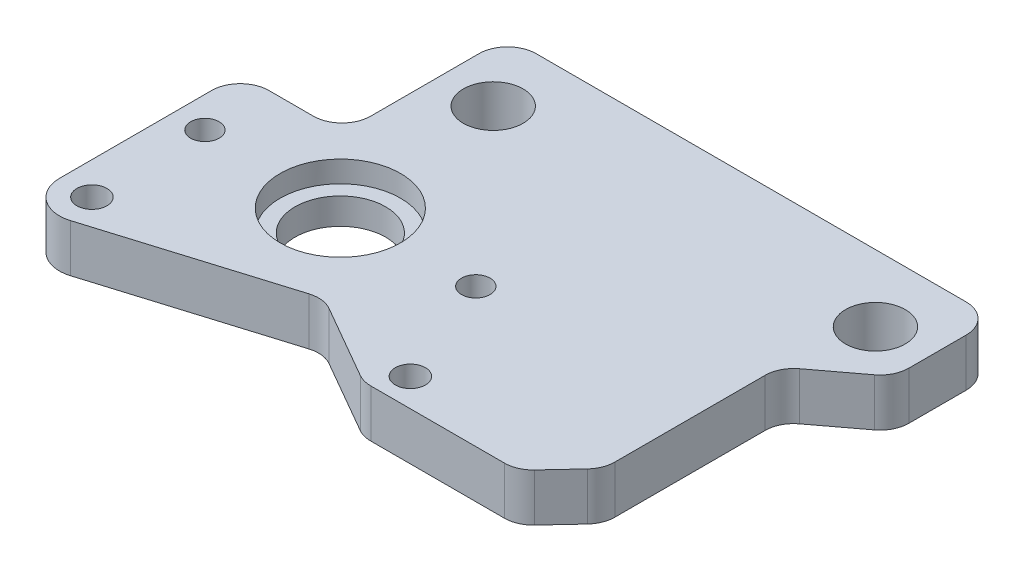
ISO-10303-21;
HEADER;
FILE_DESCRIPTION(('STEP AP214'),'2;1');
FILE_NAME('part.step','',(''),(''),'','','');
FILE_SCHEMA(('AUTOMOTIVE_DESIGN { 1 0 10303 214 1 1 1 1 }'));
ENDSEC;
DATA;
#1=APPLICATION_CONTEXT('core data for automotive mechanical design processes');
#2=APPLICATION_PROTOCOL_DEFINITION('international standard','automotive_design',2000,#1);
#3=PRODUCT_CONTEXT('',#1,'mechanical');
#4=PRODUCT('Part','Part','',(#3));
#5=PRODUCT_RELATED_PRODUCT_CATEGORY('part','',(#4));
#6=PRODUCT_DEFINITION_FORMATION('','',#4);
#7=PRODUCT_DEFINITION_CONTEXT('part definition',#1,'design');
#8=PRODUCT_DEFINITION('design','',#6,#7);
#9=PRODUCT_DEFINITION_SHAPE('','',#8);
#10=(LENGTH_UNIT() NAMED_UNIT(*) SI_UNIT(.MILLI.,.METRE.));
#11=(NAMED_UNIT(*) PLANE_ANGLE_UNIT() SI_UNIT($,.RADIAN.));
#12=(NAMED_UNIT(*) SI_UNIT($,.STERADIAN.) SOLID_ANGLE_UNIT());
#13=UNCERTAINTY_MEASURE_WITH_UNIT(LENGTH_MEASURE(1.E-05),#10,'distance_accuracy_value','');
#14=(GEOMETRIC_REPRESENTATION_CONTEXT(3) GLOBAL_UNCERTAINTY_ASSIGNED_CONTEXT((#13)) GLOBAL_UNIT_ASSIGNED_CONTEXT((#10,
#11,#12)) REPRESENTATION_CONTEXT('',''));
#15=CARTESIAN_POINT('',(0.,0.,0.));
#16=DIRECTION('',(0.,0.,1.));
#17=DIRECTION('',(1.,0.,0.));
#18=AXIS2_PLACEMENT_3D('',#15,#16,#17);
#19=CARTESIAN_POINT('',(0.,-6.35,0.));
#20=DIRECTION('',(0.,1.,0.));
#21=DIRECTION('',(0.,0.,1.));
#22=AXIS2_PLACEMENT_3D('',#19,#20,#21);
#23=CYLINDRICAL_SURFACE('',#22,8.);
#24=CARTESIAN_POINT('',(0.,0.,0.));
#25=DIRECTION('',(0.,1.,0.));
#26=DIRECTION('',(0.,0.,1.));
#27=AXIS2_PLACEMENT_3D('',#24,#25,#26);
#28=CIRCLE('',#27,8.);
#29=CARTESIAN_POINT('',(0.,0.,8.));
#30=VERTEX_POINT('',#29);
#31=EDGE_CURVE('E241',#30,#30,#28,.T.);
#32=ORIENTED_EDGE('',*,*,#31,.T.);
#33=EDGE_LOOP('',(#32));
#34=FACE_BOUND('',#33,.T.);
#35=CARTESIAN_POINT('',(0.,-2.85,0.));
#36=DIRECTION('',(0.,-1.,0.));
#37=DIRECTION('',(0.,0.,-1.));
#38=AXIS2_PLACEMENT_3D('',#35,#36,#37);
#39=CIRCLE('',#38,8.);
#40=CARTESIAN_POINT('',(0.,-2.85,-8.));
#41=VERTEX_POINT('',#40);
#42=EDGE_CURVE('E11',#41,#41,#39,.F.);
#43=ORIENTED_EDGE('',*,*,#42,.F.);
#44=EDGE_LOOP('',(#43));
#45=FACE_BOUND('',#44,.T.);
#46=ADVANCED_FACE('F43',(#34,#45),#23,.F.);
#47=CARTESIAN_POINT('',(4.00320661854568,-6.35,13.0969768672636));
#48=DIRECTION('',(-0.29230886403007,0.,-0.95632396603319));
#49=DIRECTION('',(-0.95632396603319,0.,0.29230886403007));
#50=AXIS2_PLACEMENT_3D('',#47,#48,#49);
#51=PLANE('',#50);
#52=DIRECTION('',(-0.95632396603319,0.,0.29230886403007));
#53=VECTOR('',#52,1.);
#54=CARTESIAN_POINT('',(4.00320661854568,0.,13.0969768672636));
#55=LINE('',#54,#53);
#56=CARTESIAN_POINT('',(7.76555921931062,0.,11.9469805753459));
#57=VERTEX_POINT('',#56);
#58=CARTESIAN_POINT('',(-16.5178103251182,0.,19.3694068853313));
#59=VERTEX_POINT('',#58);
#60=EDGE_CURVE('E261',#57,#59,#55,.T.);
#61=ORIENTED_EDGE('',*,*,#60,.T.);
#62=DIRECTION('',(0.,1.,0.));
#63=VECTOR('',#62,1.);
#64=CARTESIAN_POINT('',(-16.5178103251182,-6.35,19.3694068853313));
#65=LINE('',#64,#63);
#66=CARTESIAN_POINT('',(-16.5178103251182,-6.35,19.3694068853313));
#67=VERTEX_POINT('',#66);
#68=EDGE_CURVE('E53',#67,#59,#65,.T.);
#69=ORIENTED_EDGE('',*,*,#68,.F.);
#70=DIRECTION('',(-0.95632396603319,0.,0.29230886403007));
#71=VECTOR('',#70,1.);
#72=CARTESIAN_POINT('',(4.00320661854568,-6.35,13.0969768672636));
#73=LINE('',#72,#71);
#74=CARTESIAN_POINT('',(7.76555921931062,-6.35,11.9469805753459));
#75=VERTEX_POINT('',#74);
#76=EDGE_CURVE('E405',#75,#67,#73,.T.);
#77=ORIENTED_EDGE('',*,*,#76,.F.);
#78=DIRECTION('',(0.,1.,0.));
#79=VECTOR('',#78,1.);
#80=CARTESIAN_POINT('',(7.76555921931062,-6.35,11.9469805753459));
#81=LINE('',#80,#79);
#82=EDGE_CURVE('E141',#75,#57,#81,.T.);
#83=ORIENTED_EDGE('',*,*,#82,.T.);
#84=EDGE_LOOP('',(#61,#69,#77,#83));
#85=FACE_BOUND('',#84,.T.);
#86=ADVANCED_FACE('F403',(#85),#51,.F.);
#87=CARTESIAN_POINT('',(-17.78,-6.35,15.24));
#88=DIRECTION('',(0.,1.,0.));
#89=DIRECTION('',(0.,0.,1.));
#90=AXIS2_PLACEMENT_3D('',#87,#88,#89);
#91=CYLINDRICAL_SURFACE('',#90,4.318);
#92=CARTESIAN_POINT('',(-17.78,0.,15.24));
#93=DIRECTION('',(0.,1.,0.));
#94=DIRECTION('',(0.,0.,1.));
#95=AXIS2_PLACEMENT_3D('',#92,#93,#94);
#96=CIRCLE('',#95,4.318);
#97=CARTESIAN_POINT('',(-22.098,0.,15.24));
#98=VERTEX_POINT('',#97);
#99=EDGE_CURVE('E129',#59,#98,#96,.F.);
#100=ORIENTED_EDGE('',*,*,#99,.T.);
#101=DIRECTION('',(0.,1.,0.));
#102=VECTOR('',#101,1.);
#103=CARTESIAN_POINT('',(-22.098,-6.35,15.24));
#104=LINE('',#103,#102);
#105=CARTESIAN_POINT('',(-22.098,-6.35,15.24));
#106=VERTEX_POINT('',#105);
#107=EDGE_CURVE('E216',#106,#98,#104,.T.);
#108=ORIENTED_EDGE('',*,*,#107,.F.);
#109=CARTESIAN_POINT('',(-17.78,-6.35,15.24));
#110=DIRECTION('',(0.,1.,0.));
#111=DIRECTION('',(0.,0.,1.));
#112=AXIS2_PLACEMENT_3D('',#109,#110,#111);
#113=CIRCLE('',#112,4.318);
#114=EDGE_CURVE('E61',#67,#106,#113,.F.);
#115=ORIENTED_EDGE('',*,*,#114,.F.);
#116=ORIENTED_EDGE('',*,*,#68,.T.);
#117=EDGE_LOOP('',(#100,#108,#115,#116));
#118=FACE_BOUND('',#117,.T.);
#119=ADVANCED_FACE('F601',(#118),#91,.T.);
#120=CARTESIAN_POINT('',(-22.098,-6.35,0.));
#121=DIRECTION('',(1.,0.,0.));
#122=DIRECTION('',(0.,0.,-1.));
#123=AXIS2_PLACEMENT_3D('',#120,#121,#122);
#124=PLANE('',#123);
#125=DIRECTION('',(0.,0.,-1.));
#126=VECTOR('',#125,1.);
#127=CARTESIAN_POINT('',(-22.098,0.,0.));
#128=LINE('',#127,#126);
#129=CARTESIAN_POINT('',(-22.098,0.,-4.98750012199999));
#130=VERTEX_POINT('',#129);
#131=EDGE_CURVE('E212',#98,#130,#128,.T.);
#132=ORIENTED_EDGE('',*,*,#131,.T.);
#133=DIRECTION('',(0.,1.,0.));
#134=VECTOR('',#133,1.);
#135=CARTESIAN_POINT('',(-22.098,-6.35,-4.98750012199999));
#136=LINE('',#135,#134);
#137=CARTESIAN_POINT('',(-22.098,-6.35,-4.98750012199999));
#138=VERTEX_POINT('',#137);
#139=EDGE_CURVE('E210',#138,#130,#136,.T.);
#140=ORIENTED_EDGE('',*,*,#139,.F.);
#141=DIRECTION('',(0.,0.,-1.));
#142=VECTOR('',#141,1.);
#143=CARTESIAN_POINT('',(-22.098,-6.35,0.));
#144=LINE('',#143,#142);
#145=EDGE_CURVE('E199',#106,#138,#144,.T.);
#146=ORIENTED_EDGE('',*,*,#145,.F.);
#147=ORIENTED_EDGE('',*,*,#107,.T.);
#148=EDGE_LOOP('',(#132,#140,#146,#147));
#149=FACE_BOUND('',#148,.T.);
#150=ADVANCED_FACE('F211',(#149),#124,.F.);
#151=CARTESIAN_POINT('',(-18.288,-6.35,-4.98750012199999));
#152=DIRECTION('',(0.,1.,0.));
#153=DIRECTION('',(0.,0.,1.));
#154=AXIS2_PLACEMENT_3D('',#151,#152,#153);
#155=CYLINDRICAL_SURFACE('',#154,3.81);
#156=CARTESIAN_POINT('',(-18.288,0.,-4.98750012199999));
#157=DIRECTION('',(0.,1.,0.));
#158=DIRECTION('',(0.,0.,1.));
#159=AXIS2_PLACEMENT_3D('',#156,#157,#158);
#160=CIRCLE('',#159,3.81);
#161=CARTESIAN_POINT('',(-18.288,0.,-8.797500122));
#162=VERTEX_POINT('',#161);
#163=EDGE_CURVE('E330',#130,#162,#160,.F.);
#164=ORIENTED_EDGE('',*,*,#163,.T.);
#165=DIRECTION('',(0.,1.,0.));
#166=VECTOR('',#165,1.);
#167=CARTESIAN_POINT('',(-18.288,-6.35,-8.797500122));
#168=LINE('',#167,#166);
#169=CARTESIAN_POINT('',(-18.288,-6.35,-8.797500122));
#170=VERTEX_POINT('',#169);
#171=EDGE_CURVE('E217',#170,#162,#168,.T.);
#172=ORIENTED_EDGE('',*,*,#171,.F.);
#173=CARTESIAN_POINT('',(-18.288,-6.35,-4.98750012199999));
#174=DIRECTION('',(0.,1.,0.));
#175=DIRECTION('',(0.,0.,1.));
#176=AXIS2_PLACEMENT_3D('',#173,#174,#175);
#177=CIRCLE('',#176,3.81);
#178=EDGE_CURVE('E204',#138,#170,#177,.F.);
#179=ORIENTED_EDGE('',*,*,#178,.F.);
#180=ORIENTED_EDGE('',*,*,#139,.T.);
#181=EDGE_LOOP('',(#164,#172,#179,#180));
#182=FACE_BOUND('',#181,.T.);
#183=ADVANCED_FACE('F219',(#182),#155,.T.);
#184=CARTESIAN_POINT('',(0.,-6.35,-8.797500122));
#185=DIRECTION('',(0.,0.,1.));
#186=DIRECTION('',(1.,0.,0.));
#187=AXIS2_PLACEMENT_3D('',#184,#185,#186);
#188=PLANE('',#187);
#189=DIRECTION('',(1.,0.,0.));
#190=VECTOR('',#189,1.);
#191=CARTESIAN_POINT('',(0.,0.,-8.797500122));
#192=LINE('',#191,#190);
#193=CARTESIAN_POINT('',(-12.3825,0.,-8.797500122));
#194=VERTEX_POINT('',#193);
#195=EDGE_CURVE('E327',#162,#194,#192,.T.);
#196=ORIENTED_EDGE('',*,*,#195,.T.);
#197=DIRECTION('',(0.,1.,0.));
#198=VECTOR('',#197,1.);
#199=CARTESIAN_POINT('',(-12.3825,-6.35,-8.797500122));
#200=LINE('',#199,#198);
#201=CARTESIAN_POINT('',(-12.3825,-6.35,-8.797500122));
#202=VERTEX_POINT('',#201);
#203=EDGE_CURVE('E344',#202,#194,#200,.T.);
#204=ORIENTED_EDGE('',*,*,#203,.F.);
#205=DIRECTION('',(1.,0.,0.));
#206=VECTOR('',#205,1.);
#207=CARTESIAN_POINT('',(0.,-6.35,-8.797500122));
#208=LINE('',#207,#206);
#209=EDGE_CURVE('E223',#170,#202,#208,.T.);
#210=ORIENTED_EDGE('',*,*,#209,.F.);
#211=ORIENTED_EDGE('',*,*,#171,.T.);
#212=EDGE_LOOP('',(#196,#204,#210,#211));
#213=FACE_BOUND('',#212,.T.);
#214=ADVANCED_FACE('F502',(#213),#188,.F.);
#215=CARTESIAN_POINT('',(-12.3825,-6.35,-12.607500122));
#216=DIRECTION('',(0.,1.,0.));
#217=DIRECTION('',(0.,0.,1.));
#218=AXIS2_PLACEMENT_3D('',#215,#216,#217);
#219=CYLINDRICAL_SURFACE('',#218,3.81);
#220=CARTESIAN_POINT('',(-12.3825,0.,-12.607500122));
#221=DIRECTION('',(0.,1.,0.));
#222=DIRECTION('',(0.,0.,1.));
#223=AXIS2_PLACEMENT_3D('',#220,#221,#222);
#224=CIRCLE('',#223,3.81);
#225=CARTESIAN_POINT('',(-8.57250000000001,0.,-12.607500122));
#226=VERTEX_POINT('',#225);
#227=EDGE_CURVE('E323',#194,#226,#224,.T.);
#228=ORIENTED_EDGE('',*,*,#227,.T.);
#229=DIRECTION('',(0.,1.,0.));
#230=VECTOR('',#229,1.);
#231=CARTESIAN_POINT('',(-8.57250000000001,-6.35,-12.607500122));
#232=LINE('',#231,#230);
#233=CARTESIAN_POINT('',(-8.57250000000001,-6.35,-12.607500122));
#234=VERTEX_POINT('',#233);
#235=EDGE_CURVE('E348',#234,#226,#232,.T.);
#236=ORIENTED_EDGE('',*,*,#235,.F.);
#237=CARTESIAN_POINT('',(-12.3825,-6.35,-12.607500122));
#238=DIRECTION('',(0.,1.,0.));
#239=DIRECTION('',(0.,0.,1.));
#240=AXIS2_PLACEMENT_3D('',#237,#238,#239);
#241=CIRCLE('',#240,3.81);
#242=EDGE_CURVE('E226',#202,#234,#241,.T.);
#243=ORIENTED_EDGE('',*,*,#242,.F.);
#244=ORIENTED_EDGE('',*,*,#203,.T.);
#245=EDGE_LOOP('',(#228,#236,#243,#244));
#246=FACE_BOUND('',#245,.T.);
#247=ADVANCED_FACE('F498',(#246),#219,.F.);
#248=CARTESIAN_POINT('',(-8.57250000000001,-6.35,0.));
#249=DIRECTION('',(-1.,0.,0.));
#250=DIRECTION('',(0.,0.,1.));
#251=AXIS2_PLACEMENT_3D('',#248,#249,#250);
#252=PLANE('',#251);
#253=DIRECTION('',(0.,0.,1.));
#254=VECTOR('',#253,1.);
#255=CARTESIAN_POINT('',(-8.57250000000001,0.,0.));
#256=LINE('',#255,#254);
#257=CARTESIAN_POINT('',(-8.5725,0.,-26.9875));
#258=VERTEX_POINT('',#257);
#259=EDGE_CURVE('E319',#258,#226,#256,.T.);
#260=ORIENTED_EDGE('',*,*,#259,.F.);
#261=DIRECTION('',(0.,1.,0.));
#262=VECTOR('',#261,1.);
#263=CARTESIAN_POINT('',(-8.5725,-6.35,-26.9875));
#264=LINE('',#263,#262);
#265=CARTESIAN_POINT('',(-8.5725,-6.35,-26.9875));
#266=VERTEX_POINT('',#265);
#267=EDGE_CURVE('E351',#266,#258,#264,.T.);
#268=ORIENTED_EDGE('',*,*,#267,.F.);
#269=DIRECTION('',(0.,0.,1.));
#270=VECTOR('',#269,1.);
#271=CARTESIAN_POINT('',(-8.57250000000001,-6.35,0.));
#272=LINE('',#271,#270);
#273=EDGE_CURVE('E495',#266,#234,#272,.T.);
#274=ORIENTED_EDGE('',*,*,#273,.T.);
#275=ORIENTED_EDGE('',*,*,#235,.T.);
#276=EDGE_LOOP('',(#260,#268,#274,#275));
#277=FACE_BOUND('',#276,.T.);
#278=ADVANCED_FACE('F491',(#277),#252,.T.);
#279=CARTESIAN_POINT('',(-4.7625,-6.35,-26.9875));
#280=DIRECTION('',(0.,1.,0.));
#281=DIRECTION('',(0.,0.,1.));
#282=AXIS2_PLACEMENT_3D('',#279,#280,#281);
#283=CYLINDRICAL_SURFACE('',#282,3.81);
#284=CARTESIAN_POINT('',(-4.7625,0.,-26.9875));
#285=DIRECTION('',(0.,1.,0.));
#286=DIRECTION('',(0.,0.,1.));
#287=AXIS2_PLACEMENT_3D('',#284,#285,#286);
#288=CIRCLE('',#287,3.81);
#289=CARTESIAN_POINT('',(-4.7625,0.,-30.7975));
#290=VERTEX_POINT('',#289);
#291=EDGE_CURVE('E315',#258,#290,#288,.F.);
#292=ORIENTED_EDGE('',*,*,#291,.T.);
#293=DIRECTION('',(0.,1.,0.));
#294=VECTOR('',#293,1.);
#295=CARTESIAN_POINT('',(-4.7625,-6.35,-30.7975));
#296=LINE('',#295,#294);
#297=CARTESIAN_POINT('',(-4.7625,-6.35,-30.7975));
#298=VERTEX_POINT('',#297);
#299=EDGE_CURVE('E354',#298,#290,#296,.T.);
#300=ORIENTED_EDGE('',*,*,#299,.F.);
#301=CARTESIAN_POINT('',(-4.7625,-6.35,-26.9875));
#302=DIRECTION('',(0.,1.,0.));
#303=DIRECTION('',(0.,0.,1.));
#304=AXIS2_PLACEMENT_3D('',#301,#302,#303);
#305=CIRCLE('',#304,3.81);
#306=EDGE_CURVE('E505',#266,#298,#305,.F.);
#307=ORIENTED_EDGE('',*,*,#306,.F.);
#308=ORIENTED_EDGE('',*,*,#267,.T.);
#309=EDGE_LOOP('',(#292,#300,#307,#308));
#310=FACE_BOUND('',#309,.T.);
#311=ADVANCED_FACE('F487',(#310),#283,.T.);
#312=CARTESIAN_POINT('',(0.,-6.35,-30.7975));
#313=DIRECTION('',(0.,0.,-1.));
#314=DIRECTION('',(-1.,0.,0.));
#315=AXIS2_PLACEMENT_3D('',#312,#313,#314);
#316=PLANE('',#315);
#317=DIRECTION('',(-1.,0.,0.));
#318=VECTOR('',#317,1.);
#319=CARTESIAN_POINT('',(0.,0.,-30.7975));
#320=LINE('',#319,#318);
#321=CARTESIAN_POINT('',(52.3875,0.,-30.7975));
#322=VERTEX_POINT('',#321);
#323=EDGE_CURVE('E311',#322,#290,#320,.T.);
#324=ORIENTED_EDGE('',*,*,#323,.F.);
#325=DIRECTION('',(0.,1.,0.));
#326=VECTOR('',#325,1.);
#327=CARTESIAN_POINT('',(52.3875,-6.35,-30.7975));
#328=LINE('',#327,#326);
#329=CARTESIAN_POINT('',(52.3875,-6.35,-30.7975));
#330=VERTEX_POINT('',#329);
#331=EDGE_CURVE('E357',#330,#322,#328,.T.);
#332=ORIENTED_EDGE('',*,*,#331,.F.);
#333=DIRECTION('',(-1.,0.,0.));
#334=VECTOR('',#333,1.);
#335=CARTESIAN_POINT('',(0.,-6.35,-30.7975));
#336=LINE('',#335,#334);
#337=EDGE_CURVE('E484',#330,#298,#336,.T.);
#338=ORIENTED_EDGE('',*,*,#337,.T.);
#339=ORIENTED_EDGE('',*,*,#299,.T.);
#340=EDGE_LOOP('',(#324,#332,#338,#339));
#341=FACE_BOUND('',#340,.T.);
#342=ADVANCED_FACE('F480',(#341),#316,.T.);
#343=CARTESIAN_POINT('',(52.3875,-6.35,-26.9875));
#344=DIRECTION('',(0.,1.,0.));
#345=DIRECTION('',(0.,0.,1.));
#346=AXIS2_PLACEMENT_3D('',#343,#344,#345);
#347=CYLINDRICAL_SURFACE('',#346,3.81);
#348=CARTESIAN_POINT('',(52.3875,0.,-26.9875));
#349=DIRECTION('',(0.,1.,0.));
#350=DIRECTION('',(0.,0.,1.));
#351=AXIS2_PLACEMENT_3D('',#348,#349,#350);
#352=CIRCLE('',#351,3.81);
#353=CARTESIAN_POINT('',(56.1975,0.,-26.9875));
#354=VERTEX_POINT('',#353);
#355=EDGE_CURVE('E307',#322,#354,#352,.F.);
#356=ORIENTED_EDGE('',*,*,#355,.T.);
#357=DIRECTION('',(0.,1.,0.));
#358=VECTOR('',#357,1.);
#359=CARTESIAN_POINT('',(56.1975,-6.35,-26.9875));
#360=LINE('',#359,#358);
#361=CARTESIAN_POINT('',(56.1975,-6.35,-26.9875));
#362=VERTEX_POINT('',#361);
#363=EDGE_CURVE('E360',#362,#354,#360,.T.);
#364=ORIENTED_EDGE('',*,*,#363,.F.);
#365=CARTESIAN_POINT('',(52.3875,-6.35,-26.9875));
#366=DIRECTION('',(0.,1.,0.));
#367=DIRECTION('',(0.,0.,1.));
#368=AXIS2_PLACEMENT_3D('',#365,#366,#367);
#369=CIRCLE('',#368,3.81);
#370=EDGE_CURVE('E512',#330,#362,#369,.F.);
#371=ORIENTED_EDGE('',*,*,#370,.F.);
#372=ORIENTED_EDGE('',*,*,#331,.T.);
#373=EDGE_LOOP('',(#356,#364,#371,#372));
#374=FACE_BOUND('',#373,.T.);
#375=ADVANCED_FACE('F476',(#374),#347,.T.);
#376=CARTESIAN_POINT('',(56.1975,-6.35,1.02276151248003E-13));
#377=DIRECTION('',(1.,0.,0.));
#378=DIRECTION('',(0.,0.,-1.));
#379=AXIS2_PLACEMENT_3D('',#376,#377,#378);
#380=PLANE('',#379);
#381=DIRECTION('',(0.,0.,-1.));
#382=VECTOR('',#381,1.);
#383=CARTESIAN_POINT('',(56.1975,0.,1.02276151248003E-13));
#384=LINE('',#383,#382);
#385=CARTESIAN_POINT('',(56.1975,0.,-19.3620959266836));
#386=VERTEX_POINT('',#385);
#387=EDGE_CURVE('E303',#386,#354,#384,.T.);
#388=ORIENTED_EDGE('',*,*,#387,.F.);
#389=DIRECTION('',(0.,1.,0.));
#390=VECTOR('',#389,1.);
#391=CARTESIAN_POINT('',(56.1975,-6.35,-19.3620959266836));
#392=LINE('',#391,#390);
#393=CARTESIAN_POINT('',(56.1975,-6.35,-19.3620959266836));
#394=VERTEX_POINT('',#393);
#395=EDGE_CURVE('E363',#394,#386,#392,.T.);
#396=ORIENTED_EDGE('',*,*,#395,.F.);
#397=DIRECTION('',(0.,0.,-1.));
#398=VECTOR('',#397,1.);
#399=CARTESIAN_POINT('',(56.1975,-6.35,1.02276151248003E-13));
#400=LINE('',#399,#398);
#401=EDGE_CURVE('E473',#394,#362,#400,.T.);
#402=ORIENTED_EDGE('',*,*,#401,.T.);
#403=ORIENTED_EDGE('',*,*,#363,.T.);
#404=EDGE_LOOP('',(#388,#396,#402,#403));
#405=FACE_BOUND('',#404,.T.);
#406=ADVANCED_FACE('F468',(#405),#380,.T.);
#407=CARTESIAN_POINT('',(52.3875,-6.35,-19.3620959266836));
#408=DIRECTION('',(0.,1.,0.));
#409=DIRECTION('',(0.,0.,1.));
#410=AXIS2_PLACEMENT_3D('',#407,#408,#409);
#411=CYLINDRICAL_SURFACE('',#410,3.81);
#412=CARTESIAN_POINT('',(52.3875,0.,-19.3620959266836));
#413=DIRECTION('',(0.,1.,0.));
#414=DIRECTION('',(0.,0.,1.));
#415=AXIS2_PLACEMENT_3D('',#412,#413,#414);
#416=CIRCLE('',#415,3.81);
#417=CARTESIAN_POINT('',(54.6804152382093,0.,-16.3192946334034));
#418=VERTEX_POINT('',#417);
#419=EDGE_CURVE('E299',#386,#418,#416,.F.);
#420=ORIENTED_EDGE('',*,*,#419,.T.);
#421=DIRECTION('',(0.,1.,0.));
#422=VECTOR('',#421,1.);
#423=CARTESIAN_POINT('',(54.6804152382093,-6.35,-16.3192946334034));
#424=LINE('',#423,#422);
#425=CARTESIAN_POINT('',(54.6804152382093,-6.35,-16.3192946334034));
#426=VERTEX_POINT('',#425);
#427=EDGE_CURVE('E366',#426,#418,#424,.T.);
#428=ORIENTED_EDGE('',*,*,#427,.F.);
#429=CARTESIAN_POINT('',(52.3875,-6.35,-19.3620959266836));
#430=DIRECTION('',(0.,1.,0.));
#431=DIRECTION('',(0.,0.,1.));
#432=AXIS2_PLACEMENT_3D('',#429,#430,#431);
#433=CIRCLE('',#432,3.81);
#434=EDGE_CURVE('E517',#394,#426,#433,.F.);
#435=ORIENTED_EDGE('',*,*,#434,.F.);
#436=ORIENTED_EDGE('',*,*,#395,.T.);
#437=EDGE_LOOP('',(#420,#428,#435,#436));
#438=FACE_BOUND('',#437,.T.);
#439=ADVANCED_FACE('F782',(#438),#411,.T.);
#440=CARTESIAN_POINT('',(11.9606686655756,-6.35,15.8723434157696));
#441=DIRECTION('',(0.601815023152047,0.,0.798635510047294));
#442=DIRECTION('',(0.798635510047294,0.,-0.601815023152047));
#443=AXIS2_PLACEMENT_3D('',#440,#441,#442);
#444=PLANE('',#443);
#445=DIRECTION('',(0.798635510047294,0.,-0.601815023152047));
#446=VECTOR('',#445,1.);
#447=CARTESIAN_POINT('',(11.9606686655756,0.,15.8723434157696));
#448=LINE('',#447,#446);
#449=CARTESIAN_POINT('',(48.9855664772033,0.,-12.0279182848244));
#450=VERTEX_POINT('',#449);
#451=EDGE_CURVE('E295',#450,#418,#448,.T.);
#452=ORIENTED_EDGE('',*,*,#451,.F.);
#453=DIRECTION('',(0.,1.,0.));
#454=VECTOR('',#453,1.);
#455=CARTESIAN_POINT('',(48.9855664772033,-6.35,-12.0279182848244));
#456=LINE('',#455,#454);
#457=CARTESIAN_POINT('',(48.9855664772033,-6.35,-12.0279182848244));
#458=VERTEX_POINT('',#457);
#459=EDGE_CURVE('E369',#458,#450,#456,.T.);
#460=ORIENTED_EDGE('',*,*,#459,.F.);
#461=DIRECTION('',(0.798635510047294,0.,-0.601815023152047));
#462=VECTOR('',#461,1.);
#463=CARTESIAN_POINT('',(11.9606686655756,-6.35,15.8723434157696));
#464=LINE('',#463,#462);
#465=EDGE_CURVE('E520',#458,#426,#464,.T.);
#466=ORIENTED_EDGE('',*,*,#465,.T.);
#467=ORIENTED_EDGE('',*,*,#427,.T.);
#468=EDGE_LOOP('',(#452,#460,#466,#467));
#469=FACE_BOUND('',#468,.T.);
#470=ADVANCED_FACE('F461',(#469),#444,.T.);
#471=CARTESIAN_POINT('',(51.2784817154126,-6.35,-8.98511699154425));
#472=DIRECTION('',(0.,1.,0.));
#473=DIRECTION('',(0.,0.,1.));
#474=AXIS2_PLACEMENT_3D('',#471,#472,#473);
#475=CYLINDRICAL_SURFACE('',#474,3.80999999999999);
#476=CARTESIAN_POINT('',(51.2784817154126,0.,-8.98511699154425));
#477=DIRECTION('',(0.,1.,0.));
#478=DIRECTION('',(0.,0.,1.));
#479=AXIS2_PLACEMENT_3D('',#476,#477,#478);
#480=CIRCLE('',#479,3.80999999999999);
#481=CARTESIAN_POINT('',(47.4684817154126,0.,-8.98511699154425));
#482=VERTEX_POINT('',#481);
#483=EDGE_CURVE('E291',#482,#450,#480,.F.);
#484=ORIENTED_EDGE('',*,*,#483,.F.);
#485=DIRECTION('',(0.,1.,0.));
#486=VECTOR('',#485,1.);
#487=CARTESIAN_POINT('',(47.4684817154126,-6.35,-8.98511699154425));
#488=LINE('',#487,#486);
#489=CARTESIAN_POINT('',(47.4684817154126,-6.35,-8.98511699154425));
#490=VERTEX_POINT('',#489);
#491=EDGE_CURVE('E372',#490,#482,#488,.T.);
#492=ORIENTED_EDGE('',*,*,#491,.F.);
#493=CARTESIAN_POINT('',(51.2784817154126,-6.35,-8.98511699154425));
#494=DIRECTION('',(0.,1.,0.));
#495=DIRECTION('',(0.,0.,1.));
#496=AXIS2_PLACEMENT_3D('',#493,#494,#495);
#497=CIRCLE('',#496,3.80999999999999);
#498=EDGE_CURVE('E457',#490,#458,#497,.F.);
#499=ORIENTED_EDGE('',*,*,#498,.T.);
#500=ORIENTED_EDGE('',*,*,#459,.T.);
#501=EDGE_LOOP('',(#484,#492,#499,#500));
#502=FACE_BOUND('',#501,.T.);
#503=ADVANCED_FACE('F454',(#502),#475,.F.);
#504=CARTESIAN_POINT('',(47.4684817154126,-6.35,0.));
#505=DIRECTION('',(-1.,0.,0.));
#506=DIRECTION('',(0.,0.,1.));
#507=AXIS2_PLACEMENT_3D('',#504,#505,#506);
#508=PLANE('',#507);
#509=DIRECTION('',(0.,0.,1.));
#510=VECTOR('',#509,1.);
#511=CARTESIAN_POINT('',(47.4684817154126,0.,0.));
#512=LINE('',#511,#510);
#513=CARTESIAN_POINT('',(47.4684817154126,0.,10.9806107725939));
#514=VERTEX_POINT('',#513);
#515=EDGE_CURVE('E288',#482,#514,#512,.T.);
#516=ORIENTED_EDGE('',*,*,#515,.T.);
#517=DIRECTION('',(0.,1.,0.));
#518=VECTOR('',#517,1.);
#519=CARTESIAN_POINT('',(47.4684817154126,-6.35,10.9806107725939));
#520=LINE('',#519,#518);
#521=CARTESIAN_POINT('',(47.4684817154126,-6.35,10.9806107725939));
#522=VERTEX_POINT('',#521);
#523=EDGE_CURVE('E375',#522,#514,#520,.T.);
#524=ORIENTED_EDGE('',*,*,#523,.F.);
#525=DIRECTION('',(0.,0.,1.));
#526=VECTOR('',#525,1.);
#527=CARTESIAN_POINT('',(47.4684817154126,-6.35,0.));
#528=LINE('',#527,#526);
#529=EDGE_CURVE('E450',#490,#522,#528,.T.);
#530=ORIENTED_EDGE('',*,*,#529,.F.);
#531=ORIENTED_EDGE('',*,*,#491,.T.);
#532=EDGE_LOOP('',(#516,#524,#530,#531));
#533=FACE_BOUND('',#532,.T.);
#534=ADVANCED_FACE('F449',(#533),#508,.F.);
#535=CARTESIAN_POINT('',(43.6584817154126,-6.35,10.9806107725939));
#536=DIRECTION('',(0.,1.,0.));
#537=DIRECTION('',(0.,0.,1.));
#538=AXIS2_PLACEMENT_3D('',#535,#536,#537);
#539=CYLINDRICAL_SURFACE('',#538,3.81);
#540=CARTESIAN_POINT('',(43.6584817154126,0.,10.9806107725939));
#541=DIRECTION('',(0.,1.,0.));
#542=DIRECTION('',(0.,0.,1.));
#543=AXIS2_PLACEMENT_3D('',#540,#541,#542);
#544=CIRCLE('',#543,3.81);
#545=CARTESIAN_POINT('',(46.4449393185816,0.,13.579024524432));
#546=VERTEX_POINT('',#545);
#547=EDGE_CURVE('E285',#514,#546,#544,.F.);
#548=ORIENTED_EDGE('',*,*,#547,.T.);
#549=DIRECTION('',(0.,1.,0.));
#550=VECTOR('',#549,1.);
#551=CARTESIAN_POINT('',(46.4449393185816,-6.35,13.579024524432));
#552=LINE('',#551,#550);
#553=CARTESIAN_POINT('',(46.4449393185816,-6.35,13.579024524432));
#554=VERTEX_POINT('',#553);
#555=EDGE_CURVE('E379',#554,#546,#552,.T.);
#556=ORIENTED_EDGE('',*,*,#555,.F.);
#557=CARTESIAN_POINT('',(43.6584817154126,-6.35,10.9806107725939));
#558=DIRECTION('',(0.,1.,0.));
#559=DIRECTION('',(0.,0.,1.));
#560=AXIS2_PLACEMENT_3D('',#557,#558,#559);
#561=CIRCLE('',#560,3.81);
#562=EDGE_CURVE('E445',#522,#554,#561,.F.);
#563=ORIENTED_EDGE('',*,*,#562,.F.);
#564=ORIENTED_EDGE('',*,*,#523,.T.);
#565=EDGE_LOOP('',(#548,#556,#563,#564));
#566=FACE_BOUND('',#565,.T.);
#567=ADVANCED_FACE('F444',(#566),#539,.T.);
#568=CARTESIAN_POINT('',(31.6153606059378,-6.35,29.4818007187193));
#569=DIRECTION('',(-0.73135370161917,0.,-0.681998360062499));
#570=DIRECTION('',(-0.681998360062499,0.,0.73135370161917));
#571=AXIS2_PLACEMENT_3D('',#568,#569,#570);
#572=PLANE('',#571);
#573=DIRECTION('',(-0.681998360062499,0.,0.73135370161917));
#574=VECTOR('',#573,1.);
#575=CARTESIAN_POINT('',(31.6153606059378,0.,29.4818007187193));
#576=LINE('',#575,#574);
#577=CARTESIAN_POINT('',(43.0441600965525,0.,17.2259137518381));
#578=VERTEX_POINT('',#577);
#579=EDGE_CURVE('E282',#546,#578,#576,.T.);
#580=ORIENTED_EDGE('',*,*,#579,.T.);
#581=DIRECTION('',(0.,1.,0.));
#582=VECTOR('',#581,1.);
#583=CARTESIAN_POINT('',(43.0441600965525,-6.35,17.2259137518381));
#584=LINE('',#583,#582);
#585=CARTESIAN_POINT('',(43.0441600965525,-6.35,17.2259137518381));
#586=VERTEX_POINT('',#585);
#587=EDGE_CURVE('E383',#586,#578,#584,.T.);
#588=ORIENTED_EDGE('',*,*,#587,.F.);
#589=DIRECTION('',(-0.681998360062499,0.,0.73135370161917));
#590=VECTOR('',#589,1.);
#591=CARTESIAN_POINT('',(31.6153606059378,-6.35,29.4818007187193));
#592=LINE('',#591,#590);
#593=EDGE_CURVE('E441',#554,#586,#592,.T.);
#594=ORIENTED_EDGE('',*,*,#593,.F.);
#595=ORIENTED_EDGE('',*,*,#555,.T.);
#596=EDGE_LOOP('',(#580,#588,#594,#595));
#597=FACE_BOUND('',#596,.T.);
#598=ADVANCED_FACE('F438',(#597),#572,.F.);
#599=CARTESIAN_POINT('',(40.2577024933834,-6.35,14.6275));
#600=DIRECTION('',(0.,1.,0.));
#601=DIRECTION('',(0.,0.,1.));
#602=AXIS2_PLACEMENT_3D('',#599,#600,#601);
#603=CYLINDRICAL_SURFACE('',#602,3.81);
#604=CARTESIAN_POINT('',(40.2577024933834,0.,14.6275));
#605=DIRECTION('',(0.,1.,0.));
#606=DIRECTION('',(0.,0.,1.));
#607=AXIS2_PLACEMENT_3D('',#604,#605,#606);
#608=CIRCLE('',#607,3.81);
#609=CARTESIAN_POINT('',(40.2577024933834,0.,18.4375));
#610=VERTEX_POINT('',#609);
#611=EDGE_CURVE('E279',#578,#610,#608,.F.);
#612=ORIENTED_EDGE('',*,*,#611,.T.);
#613=DIRECTION('',(0.,1.,0.));
#614=VECTOR('',#613,1.);
#615=CARTESIAN_POINT('',(40.2577024933834,-6.35,18.4375));
#616=LINE('',#615,#614);
#617=CARTESIAN_POINT('',(40.2577024933834,-6.35,18.4375));
#618=VERTEX_POINT('',#617);
#619=EDGE_CURVE('E387',#618,#610,#616,.T.);
#620=ORIENTED_EDGE('',*,*,#619,.F.);
#621=CARTESIAN_POINT('',(40.2577024933834,-6.35,14.6275));
#622=DIRECTION('',(0.,1.,0.));
#623=DIRECTION('',(0.,0.,1.));
#624=AXIS2_PLACEMENT_3D('',#621,#622,#623);
#625=CIRCLE('',#624,3.81);
#626=EDGE_CURVE('E432',#586,#618,#625,.F.);
#627=ORIENTED_EDGE('',*,*,#626,.F.);
#628=ORIENTED_EDGE('',*,*,#587,.T.);
#629=EDGE_LOOP('',(#612,#620,#627,#628));
#630=FACE_BOUND('',#629,.T.);
#631=ADVANCED_FACE('F431',(#630),#603,.T.);
#632=CARTESIAN_POINT('',(0.,-6.35,18.4375));
#633=DIRECTION('',(0.,0.,-1.));
#634=DIRECTION('',(-1.,0.,0.));
#635=AXIS2_PLACEMENT_3D('',#632,#633,#634);
#636=PLANE('',#635);
#637=DIRECTION('',(-1.,0.,0.));
#638=VECTOR('',#637,1.);
#639=CARTESIAN_POINT('',(0.,0.,18.4375));
#640=LINE('',#639,#638);
#641=CARTESIAN_POINT('',(22.4839005830095,0.,18.4375));
#642=VERTEX_POINT('',#641);
#643=EDGE_CURVE('E276',#610,#642,#640,.T.);
#644=ORIENTED_EDGE('',*,*,#643,.T.);
#645=DIRECTION('',(0.,1.,0.));
#646=VECTOR('',#645,1.);
#647=CARTESIAN_POINT('',(22.4839005830095,-6.35,18.4375));
#648=LINE('',#647,#646);
#649=CARTESIAN_POINT('',(22.4839005830095,-6.35,18.4375));
#650=VERTEX_POINT('',#649);
#651=EDGE_CURVE('E391',#650,#642,#648,.T.);
#652=ORIENTED_EDGE('',*,*,#651,.F.);
#653=DIRECTION('',(-1.,0.,0.));
#654=VECTOR('',#653,1.);
#655=CARTESIAN_POINT('',(0.,-6.35,18.4375));
#656=LINE('',#655,#654);
#657=EDGE_CURVE('E427',#618,#650,#656,.T.);
#658=ORIENTED_EDGE('',*,*,#657,.F.);
#659=ORIENTED_EDGE('',*,*,#619,.T.);
#660=EDGE_LOOP('',(#644,#652,#658,#659));
#661=FACE_BOUND('',#660,.T.);
#662=ADVANCED_FACE('F426',(#661),#636,.F.);
#663=CARTESIAN_POINT('',(22.4839005830095,-6.35,14.6275));
#664=DIRECTION('',(0.,1.,0.));
#665=DIRECTION('',(0.,0.,1.));
#666=AXIS2_PLACEMENT_3D('',#663,#664,#665);
#667=CYLINDRICAL_SURFACE('',#666,3.81);
#668=CARTESIAN_POINT('',(22.4839005830095,0.,14.6275));
#669=DIRECTION('',(0.,1.,0.));
#670=DIRECTION('',(0.,0.,1.));
#671=AXIS2_PLACEMENT_3D('',#668,#669,#670);
#672=CIRCLE('',#671,3.81);
#673=CARTESIAN_POINT('',(20.5836799249687,0.,17.9298115314511));
#674=VERTEX_POINT('',#673);
#675=EDGE_CURVE('E273',#642,#674,#672,.F.);
#676=ORIENTED_EDGE('',*,*,#675,.T.);
#677=DIRECTION('',(0.,1.,0.));
#678=VECTOR('',#677,1.);
#679=CARTESIAN_POINT('',(20.5836799249687,-6.35,17.9298115314511));
#680=LINE('',#679,#678);
#681=CARTESIAN_POINT('',(20.5836799249687,-6.35,17.9298115314511));
#682=VERTEX_POINT('',#681);
#683=EDGE_CURVE('E395',#682,#674,#680,.T.);
#684=ORIENTED_EDGE('',*,*,#683,.F.);
#685=CARTESIAN_POINT('',(22.4839005830095,-6.35,14.6275));
#686=DIRECTION('',(0.,1.,0.));
#687=DIRECTION('',(0.,0.,1.));
#688=AXIS2_PLACEMENT_3D('',#685,#686,#687);
#689=CIRCLE('',#688,3.81);
#690=EDGE_CURVE('E423',#650,#682,#689,.F.);
#691=ORIENTED_EDGE('',*,*,#690,.F.);
#692=ORIENTED_EDGE('',*,*,#651,.T.);
#693=EDGE_LOOP('',(#676,#684,#691,#692));
#694=FACE_BOUND('',#693,.T.);
#695=ADVANCED_FACE('F420',(#694),#667,.T.);
#696=CARTESIAN_POINT('',(-2.63069175478496,-6.35,4.57176574770906));
#697=DIRECTION('',(0.498745579538251,0.,-0.866748433451745));
#698=DIRECTION('',(-0.866748433451745,0.,-0.498745579538251));
#699=AXIS2_PLACEMENT_3D('',#696,#697,#698);
#700=PLANE('',#699);
#701=DIRECTION('',(-0.866748433451745,0.,-0.498745579538251));
#702=VECTOR('',#701,1.);
#703=CARTESIAN_POINT('',(-2.63069175478496,0.,4.57176574770906));
#704=LINE('',#703,#702);
#705=CARTESIAN_POINT('',(10.779476649306,0.,12.2882633544812));
#706=VERTEX_POINT('',#705);
#707=EDGE_CURVE('E269',#674,#706,#704,.T.);
#708=ORIENTED_EDGE('',*,*,#707,.T.);
#709=DIRECTION('',(0.,1.,0.));
#710=VECTOR('',#709,1.);
#711=CARTESIAN_POINT('',(10.779476649306,-6.35,12.2882633544812));
#712=LINE('',#711,#710);
#713=CARTESIAN_POINT('',(10.779476649306,-6.35,12.2882633544812));
#714=VERTEX_POINT('',#713);
#715=EDGE_CURVE('E399',#714,#706,#712,.T.);
#716=ORIENTED_EDGE('',*,*,#715,.F.);
#717=DIRECTION('',(-0.866748433451745,0.,-0.498745579538251));
#718=VECTOR('',#717,1.);
#719=CARTESIAN_POINT('',(-2.63069175478496,-6.35,4.57176574770906));
#720=LINE('',#719,#718);
#721=EDGE_CURVE('E537',#682,#714,#720,.T.);
#722=ORIENTED_EDGE('',*,*,#721,.F.);
#723=ORIENTED_EDGE('',*,*,#683,.T.);
#724=EDGE_LOOP('',(#708,#716,#722,#723));
#725=FACE_BOUND('',#724,.T.);
#726=ADVANCED_FACE('F414',(#725),#700,.F.);
#727=CARTESIAN_POINT('',(-17.78,-6.35,15.24));
#728=DIRECTION('',(0.,1.,0.));
#729=DIRECTION('',(0.,0.,1.));
#730=AXIS2_PLACEMENT_3D('',#727,#728,#729);
#731=CYLINDRICAL_SURFACE('',#730,2.);
#732=CARTESIAN_POINT('',(-17.78,-6.35,15.24));
#733=DIRECTION('',(0.,1.,0.));
#734=DIRECTION('',(0.,0.,1.));
#735=AXIS2_PLACEMENT_3D('',#732,#733,#734);
#736=CIRCLE('',#735,2.);
#737=CARTESIAN_POINT('',(-17.78,-6.35,17.24));
#738=VERTEX_POINT('',#737);
#739=EDGE_CURVE('E544',#738,#738,#736,.T.);
#740=ORIENTED_EDGE('',*,*,#739,.F.);
#741=EDGE_LOOP('',(#740));
#742=FACE_BOUND('',#741,.T.);
#743=CARTESIAN_POINT('',(-17.78,0.,15.24));
#744=DIRECTION('',(0.,1.,0.));
#745=DIRECTION('',(0.,0.,1.));
#746=AXIS2_PLACEMENT_3D('',#743,#744,#745);
#747=CIRCLE('',#746,2.);
#748=CARTESIAN_POINT('',(-17.78,0.,17.24));
#749=VERTEX_POINT('',#748);
#750=EDGE_CURVE('E257',#749,#749,#747,.T.);
#751=ORIENTED_EDGE('',*,*,#750,.T.);
#752=EDGE_LOOP('',(#751));
#753=FACE_BOUND('',#752,.T.);
#754=ADVANCED_FACE('F632',(#742,#753),#731,.F.);
#755=CARTESIAN_POINT('',(24.0125212267774,-6.35,14.7035990265501));
#756=DIRECTION('',(0.,1.,0.));
#757=DIRECTION('',(0.,0.,1.));
#758=AXIS2_PLACEMENT_3D('',#755,#756,#757);
#759=CYLINDRICAL_SURFACE('',#758,2.00000000000001);
#760=CARTESIAN_POINT('',(24.0125212267774,-6.35,14.7035990265501));
#761=DIRECTION('',(0.,1.,0.));
#762=DIRECTION('',(0.,0.,1.));
#763=AXIS2_PLACEMENT_3D('',#760,#761,#762);
#764=CIRCLE('',#763,2.00000000000001);
#765=CARTESIAN_POINT('',(24.0125212267774,-6.35,16.7035990265501));
#766=VERTEX_POINT('',#765);
#767=EDGE_CURVE('E548',#766,#766,#764,.T.);
#768=ORIENTED_EDGE('',*,*,#767,.F.);
#769=EDGE_LOOP('',(#768));
#770=FACE_BOUND('',#769,.T.);
#771=CARTESIAN_POINT('',(24.0125212267774,0.,14.7035990265501));
#772=DIRECTION('',(0.,1.,0.));
#773=DIRECTION('',(0.,0.,1.));
#774=AXIS2_PLACEMENT_3D('',#771,#772,#773);
#775=CIRCLE('',#774,2.00000000000001);
#776=CARTESIAN_POINT('',(24.0125212267774,0.,16.7035990265501));
#777=VERTEX_POINT('',#776);
#778=EDGE_CURVE('E253',#777,#777,#775,.T.);
#779=ORIENTED_EDGE('',*,*,#778,.T.);
#780=EDGE_LOOP('',(#779));
#781=FACE_BOUND('',#780,.T.);
#782=ADVANCED_FACE('F634',(#770,#781),#759,.F.);
#783=CARTESIAN_POINT('',(49.2125,-6.35,-21.9075));
#784=DIRECTION('',(0.,1.,0.));
#785=DIRECTION('',(0.,0.,1.));
#786=AXIS2_PLACEMENT_3D('',#783,#784,#785);
#787=CYLINDRICAL_SURFACE('',#786,3.96874999999998);
#788=CARTESIAN_POINT('',(49.2125,-6.35,-21.9075));
#789=DIRECTION('',(0.,1.,0.));
#790=DIRECTION('',(0.,0.,1.));
#791=AXIS2_PLACEMENT_3D('',#788,#789,#790);
#792=CIRCLE('',#791,3.96874999999998);
#793=CARTESIAN_POINT('',(49.2125,-6.35,-17.93875));
#794=VERTEX_POINT('',#793);
#795=EDGE_CURVE('E552',#794,#794,#792,.T.);
#796=ORIENTED_EDGE('',*,*,#795,.F.);
#797=EDGE_LOOP('',(#796));
#798=FACE_BOUND('',#797,.T.);
#799=CARTESIAN_POINT('',(49.2125,0.,-21.9075));
#800=DIRECTION('',(0.,1.,0.));
#801=DIRECTION('',(0.,0.,1.));
#802=AXIS2_PLACEMENT_3D('',#799,#800,#801);
#803=CIRCLE('',#802,3.96874999999998);
#804=CARTESIAN_POINT('',(49.2125,0.,-17.93875));
#805=VERTEX_POINT('',#804);
#806=EDGE_CURVE('E249',#805,#805,#803,.T.);
#807=ORIENTED_EDGE('',*,*,#806,.T.);
#808=EDGE_LOOP('',(#807));
#809=FACE_BOUND('',#808,.T.);
#810=ADVANCED_FACE('F615',(#798,#809),#787,.F.);
#811=CARTESIAN_POINT('',(-1.5875,-6.35,-21.9075));
#812=DIRECTION('',(0.,1.,0.));
#813=DIRECTION('',(0.,0.,1.));
#814=AXIS2_PLACEMENT_3D('',#811,#812,#813);
#815=CYLINDRICAL_SURFACE('',#814,3.96875);
#816=CARTESIAN_POINT('',(-1.5875,-6.35,-21.9075));
#817=DIRECTION('',(0.,1.,0.));
#818=DIRECTION('',(0.,0.,1.));
#819=AXIS2_PLACEMENT_3D('',#816,#817,#818);
#820=CIRCLE('',#819,3.96875);
#821=CARTESIAN_POINT('',(-1.5875,-6.35,-17.93875));
#822=VERTEX_POINT('',#821);
#823=EDGE_CURVE('E556',#822,#822,#820,.T.);
#824=ORIENTED_EDGE('',*,*,#823,.F.);
#825=EDGE_LOOP('',(#824));
#826=FACE_BOUND('',#825,.T.);
#827=CARTESIAN_POINT('',(-1.5875,0.,-21.9075));
#828=DIRECTION('',(0.,1.,0.));
#829=DIRECTION('',(0.,0.,1.));
#830=AXIS2_PLACEMENT_3D('',#827,#828,#829);
#831=CIRCLE('',#830,3.96875);
#832=CARTESIAN_POINT('',(-1.5875,0.,-17.93875));
#833=VERTEX_POINT('',#832);
#834=EDGE_CURVE('E245',#833,#833,#831,.T.);
#835=ORIENTED_EDGE('',*,*,#834,.T.);
#836=EDGE_LOOP('',(#835));
#837=FACE_BOUND('',#836,.T.);
#838=ADVANCED_FACE('F605',(#826,#837),#815,.F.);
#839=CARTESIAN_POINT('',(18.0000000045,-6.35,0.));
#840=DIRECTION('',(0.,1.,0.));
#841=DIRECTION('',(0.,0.,1.));
#842=AXIS2_PLACEMENT_3D('',#839,#840,#841);
#843=CYLINDRICAL_SURFACE('',#842,1.89865);
#844=CARTESIAN_POINT('',(18.0000000045,-6.35,0.));
#845=DIRECTION('',(0.,1.,0.));
#846=DIRECTION('',(0.,0.,1.));
#847=AXIS2_PLACEMENT_3D('',#844,#845,#846);
#848=CIRCLE('',#847,1.89865);
#849=CARTESIAN_POINT('',(18.0000000045,-6.35,1.89865));
#850=VERTEX_POINT('',#849);
#851=EDGE_CURVE('E560',#850,#850,#848,.T.);
#852=ORIENTED_EDGE('',*,*,#851,.F.);
#853=EDGE_LOOP('',(#852));
#854=FACE_BOUND('',#853,.T.);
#855=CARTESIAN_POINT('',(18.0000000045,0.,0.));
#856=DIRECTION('',(0.,1.,0.));
#857=DIRECTION('',(0.,0.,1.));
#858=AXIS2_PLACEMENT_3D('',#855,#856,#857);
#859=CIRCLE('',#858,1.89865);
#860=CARTESIAN_POINT('',(18.0000000045,0.,1.89865));
#861=VERTEX_POINT('',#860);
#862=EDGE_CURVE('E236',#861,#861,#859,.T.);
#863=ORIENTED_EDGE('',*,*,#862,.T.);
#864=EDGE_LOOP('',(#863));
#865=FACE_BOUND('',#864,.T.);
#866=ADVANCED_FACE('F607',(#854,#865),#843,.F.);
#867=CARTESIAN_POINT('',(-18.0000000045,-6.35,0.));
#868=DIRECTION('',(0.,1.,0.));
#869=DIRECTION('',(0.,0.,1.));
#870=AXIS2_PLACEMENT_3D('',#867,#868,#869);
#871=CYLINDRICAL_SURFACE('',#870,1.89865);
#872=CARTESIAN_POINT('',(-18.0000000045,-6.35,0.));
#873=DIRECTION('',(0.,1.,0.));
#874=DIRECTION('',(0.,0.,1.));
#875=AXIS2_PLACEMENT_3D('',#872,#873,#874);
#876=CIRCLE('',#875,1.89865);
#877=CARTESIAN_POINT('',(-18.0000000045,-6.35,1.89865));
#878=VERTEX_POINT('',#877);
#879=EDGE_CURVE('E337',#878,#878,#876,.T.);
#880=ORIENTED_EDGE('',*,*,#879,.F.);
#881=EDGE_LOOP('',(#880));
#882=FACE_BOUND('',#881,.T.);
#883=CARTESIAN_POINT('',(-18.0000000045,0.,0.));
#884=DIRECTION('',(0.,1.,0.));
#885=DIRECTION('',(0.,0.,1.));
#886=AXIS2_PLACEMENT_3D('',#883,#884,#885);
#887=CIRCLE('',#886,1.89865);
#888=CARTESIAN_POINT('',(-18.0000000045,0.,1.89865));
#889=VERTEX_POINT('',#888);
#890=EDGE_CURVE('E232',#889,#889,#887,.T.);
#891=ORIENTED_EDGE('',*,*,#890,.T.);
#892=EDGE_LOOP('',(#891));
#893=FACE_BOUND('',#892,.T.);
#894=ADVANCED_FACE('F45',(#882,#893),#871,.F.);
#895=CARTESIAN_POINT('',(8.87925599126521,-6.35,15.5905748859323));
#896=DIRECTION('',(0.,1.,0.));
#897=DIRECTION('',(0.,0.,1.));
#898=AXIS2_PLACEMENT_3D('',#895,#896,#897);
#899=CYLINDRICAL_SURFACE('',#898,3.81);
#900=CARTESIAN_POINT('',(8.87925599126521,0.,15.5905748859323));
#901=DIRECTION('',(0.,1.,0.));
#902=DIRECTION('',(0.,0.,1.));
#903=AXIS2_PLACEMENT_3D('',#900,#901,#902);
#904=CIRCLE('',#903,3.81);
#905=EDGE_CURVE('E265',#57,#706,#904,.F.);
#906=ORIENTED_EDGE('',*,*,#905,.F.);
#907=ORIENTED_EDGE('',*,*,#82,.F.);
#908=CARTESIAN_POINT('',(8.87925599126521,-6.35,15.5905748859323));
#909=DIRECTION('',(0.,1.,0.));
#910=DIRECTION('',(0.,0.,1.));
#911=AXIS2_PLACEMENT_3D('',#908,#909,#910);
#912=CIRCLE('',#911,3.81);
#913=EDGE_CURVE('E411',#75,#714,#912,.F.);
#914=ORIENTED_EDGE('',*,*,#913,.T.);
#915=ORIENTED_EDGE('',*,*,#715,.T.);
#916=EDGE_LOOP('',(#906,#907,#914,#915));
#917=FACE_BOUND('',#916,.T.);
#918=ADVANCED_FACE('F409',(#917),#899,.F.);
#919=CARTESIAN_POINT('',(0.,-6.35,0.));
#920=DIRECTION('',(0.,1.,0.));
#921=DIRECTION('',(0.,0.,1.));
#922=AXIS2_PLACEMENT_3D('',#919,#920,#921);
#923=PLANE('',#922);
#924=ORIENTED_EDGE('',*,*,#879,.T.);
#925=EDGE_LOOP('',(#924));
#926=FACE_BOUND('',#925,.T.);
#927=ORIENTED_EDGE('',*,*,#851,.T.);
#928=EDGE_LOOP('',(#927));
#929=FACE_BOUND('',#928,.T.);
#930=ORIENTED_EDGE('',*,*,#823,.T.);
#931=EDGE_LOOP('',(#930));
#932=FACE_BOUND('',#931,.T.);
#933=ORIENTED_EDGE('',*,*,#795,.T.);
#934=EDGE_LOOP('',(#933));
#935=FACE_BOUND('',#934,.T.);
#936=ORIENTED_EDGE('',*,*,#767,.T.);
#937=EDGE_LOOP('',(#936));
#938=FACE_BOUND('',#937,.T.);
#939=ORIENTED_EDGE('',*,*,#739,.T.);
#940=EDGE_LOOP('',(#939));
#941=FACE_BOUND('',#940,.T.);
#942=ORIENTED_EDGE('',*,*,#76,.T.);
#943=ORIENTED_EDGE('',*,*,#114,.T.);
#944=ORIENTED_EDGE('',*,*,#145,.T.);
#945=ORIENTED_EDGE('',*,*,#178,.T.);
#946=ORIENTED_EDGE('',*,*,#209,.T.);
#947=ORIENTED_EDGE('',*,*,#242,.T.);
#948=ORIENTED_EDGE('',*,*,#273,.F.);
#949=ORIENTED_EDGE('',*,*,#306,.T.);
#950=ORIENTED_EDGE('',*,*,#337,.F.);
#951=ORIENTED_EDGE('',*,*,#370,.T.);
#952=ORIENTED_EDGE('',*,*,#401,.F.);
#953=ORIENTED_EDGE('',*,*,#434,.T.);
#954=ORIENTED_EDGE('',*,*,#465,.F.);
#955=ORIENTED_EDGE('',*,*,#498,.F.);
#956=ORIENTED_EDGE('',*,*,#529,.T.);
#957=ORIENTED_EDGE('',*,*,#562,.T.);
#958=ORIENTED_EDGE('',*,*,#593,.T.);
#959=ORIENTED_EDGE('',*,*,#626,.T.);
#960=ORIENTED_EDGE('',*,*,#657,.T.);
#961=ORIENTED_EDGE('',*,*,#690,.T.);
#962=ORIENTED_EDGE('',*,*,#721,.T.);
#963=ORIENTED_EDGE('',*,*,#913,.F.);
#964=EDGE_LOOP('',(#942,#943,#944,#945,#946,#947,#948,#949,#950,#951,#952,#953,#954,#955,#956,
#957,#958,#959,#960,#961,#962,#963));
#965=FACE_BOUND('',#964,.T.);
#966=CARTESIAN_POINT('',(0.,-6.35,0.));
#967=DIRECTION('',(0.,-1.,0.));
#968=DIRECTION('',(0.,0.,-1.));
#969=AXIS2_PLACEMENT_3D('',#966,#967,#968);
#970=CIRCLE('',#969,6.025);
#971=CARTESIAN_POINT('',(0.,-6.35,-6.025));
#972=VERTEX_POINT('',#971);
#973=EDGE_CURVE('E567',#972,#972,#970,.T.);
#974=ORIENTED_EDGE('',*,*,#973,.F.);
#975=EDGE_LOOP('',(#974));
#976=FACE_BOUND('',#975,.T.);
#977=ADVANCED_FACE('F201',(#926,#929,#932,#935,#938,#941,#965,#976),#923,.F.);
#978=CARTESIAN_POINT('',(0.,0.,0.));
#979=DIRECTION('',(0.,1.,0.));
#980=DIRECTION('',(0.,0.,1.));
#981=AXIS2_PLACEMENT_3D('',#978,#979,#980);
#982=PLANE('',#981);
#983=ORIENTED_EDGE('',*,*,#890,.F.);
#984=EDGE_LOOP('',(#983));
#985=FACE_BOUND('',#984,.T.);
#986=ORIENTED_EDGE('',*,*,#862,.F.);
#987=EDGE_LOOP('',(#986));
#988=FACE_BOUND('',#987,.T.);
#989=ORIENTED_EDGE('',*,*,#31,.F.);
#990=EDGE_LOOP('',(#989));
#991=FACE_BOUND('',#990,.T.);
#992=ORIENTED_EDGE('',*,*,#834,.F.);
#993=EDGE_LOOP('',(#992));
#994=FACE_BOUND('',#993,.T.);
#995=ORIENTED_EDGE('',*,*,#806,.F.);
#996=EDGE_LOOP('',(#995));
#997=FACE_BOUND('',#996,.T.);
#998=ORIENTED_EDGE('',*,*,#778,.F.);
#999=EDGE_LOOP('',(#998));
#1000=FACE_BOUND('',#999,.T.);
#1001=ORIENTED_EDGE('',*,*,#750,.F.);
#1002=EDGE_LOOP('',(#1001));
#1003=FACE_BOUND('',#1002,.T.);
#1004=ORIENTED_EDGE('',*,*,#60,.F.);
#1005=ORIENTED_EDGE('',*,*,#905,.T.);
#1006=ORIENTED_EDGE('',*,*,#707,.F.);
#1007=ORIENTED_EDGE('',*,*,#675,.F.);
#1008=ORIENTED_EDGE('',*,*,#643,.F.);
#1009=ORIENTED_EDGE('',*,*,#611,.F.);
#1010=ORIENTED_EDGE('',*,*,#579,.F.);
#1011=ORIENTED_EDGE('',*,*,#547,.F.);
#1012=ORIENTED_EDGE('',*,*,#515,.F.);
#1013=ORIENTED_EDGE('',*,*,#483,.T.);
#1014=ORIENTED_EDGE('',*,*,#451,.T.);
#1015=ORIENTED_EDGE('',*,*,#419,.F.);
#1016=ORIENTED_EDGE('',*,*,#387,.T.);
#1017=ORIENTED_EDGE('',*,*,#355,.F.);
#1018=ORIENTED_EDGE('',*,*,#323,.T.);
#1019=ORIENTED_EDGE('',*,*,#291,.F.);
#1020=ORIENTED_EDGE('',*,*,#259,.T.);
#1021=ORIENTED_EDGE('',*,*,#227,.F.);
#1022=ORIENTED_EDGE('',*,*,#195,.F.);
#1023=ORIENTED_EDGE('',*,*,#163,.F.);
#1024=ORIENTED_EDGE('',*,*,#131,.F.);
#1025=ORIENTED_EDGE('',*,*,#99,.F.);
#1026=EDGE_LOOP('',(#1004,#1005,#1006,#1007,#1008,#1009,#1010,#1011,#1012,#1013,#1014,#1015,
#1016,#1017,#1018,#1019,#1020,#1021,#1022,#1023,#1024,#1025));
#1027=FACE_BOUND('',#1026,.T.);
#1028=ADVANCED_FACE('F407',(#985,#988,#991,#994,#997,#1000,#1003,#1027),#982,.T.);
#1029=CARTESIAN_POINT('',(0.,-2.85,0.));
#1030=DIRECTION('',(0.,-1.,0.));
#1031=DIRECTION('',(0.,0.,-1.));
#1032=AXIS2_PLACEMENT_3D('',#1029,#1030,#1031);
#1033=PLANE('',#1032);
#1034=CARTESIAN_POINT('',(0.,-2.85,0.));
#1035=DIRECTION('',(0.,-1.,0.));
#1036=DIRECTION('',(0.,0.,-1.));
#1037=AXIS2_PLACEMENT_3D('',#1034,#1035,#1036);
#1038=CIRCLE('',#1037,6.025);
#1039=CARTESIAN_POINT('',(0.,-2.85,-6.025));
#1040=VERTEX_POINT('',#1039);
#1041=EDGE_CURVE('E237',#1040,#1040,#1038,.T.);
#1042=ORIENTED_EDGE('',*,*,#1041,.T.);
#1043=EDGE_LOOP('',(#1042));
#1044=FACE_BOUND('',#1043,.T.);
#1045=ORIENTED_EDGE('',*,*,#42,.T.);
#1046=EDGE_LOOP('',(#1045));
#1047=FACE_BOUND('',#1046,.T.);
#1048=ADVANCED_FACE('F575',(#1044,#1047),#1033,.F.);
#1049=CARTESIAN_POINT('',(0.,-2.85,0.));
#1050=DIRECTION('',(0.,-1.,0.));
#1051=DIRECTION('',(0.,0.,-1.));
#1052=AXIS2_PLACEMENT_3D('',#1049,#1050,#1051);
#1053=CYLINDRICAL_SURFACE('',#1052,6.025);
#1054=ORIENTED_EDGE('',*,*,#1041,.F.);
#1055=EDGE_LOOP('',(#1054));
#1056=FACE_BOUND('',#1055,.T.);
#1057=ORIENTED_EDGE('',*,*,#973,.T.);
#1058=EDGE_LOOP('',(#1057));
#1059=FACE_BOUND('',#1058,.T.);
#1060=ADVANCED_FACE('F578',(#1056,#1059),#1053,.F.);
#1061=CLOSED_SHELL('',(#46,#86,#119,#150,#183,#214,#247,#278,#311,#342,#375,#406,#439,#470,#503,
#534,#567,#598,#631,#662,#695,#726,#754,#782,#810,#838,#866,#894,#918,#977,#1028,#1048,#1060));
#1062=MANIFOLD_SOLID_BREP('B2',#1061);
#1063=ADVANCED_BREP_SHAPE_REPRESENTATION('',(#18,#1062),#14);
#1064=SHAPE_DEFINITION_REPRESENTATION(#9,#1063);
ENDSEC;
END-ISO-10303-21;
